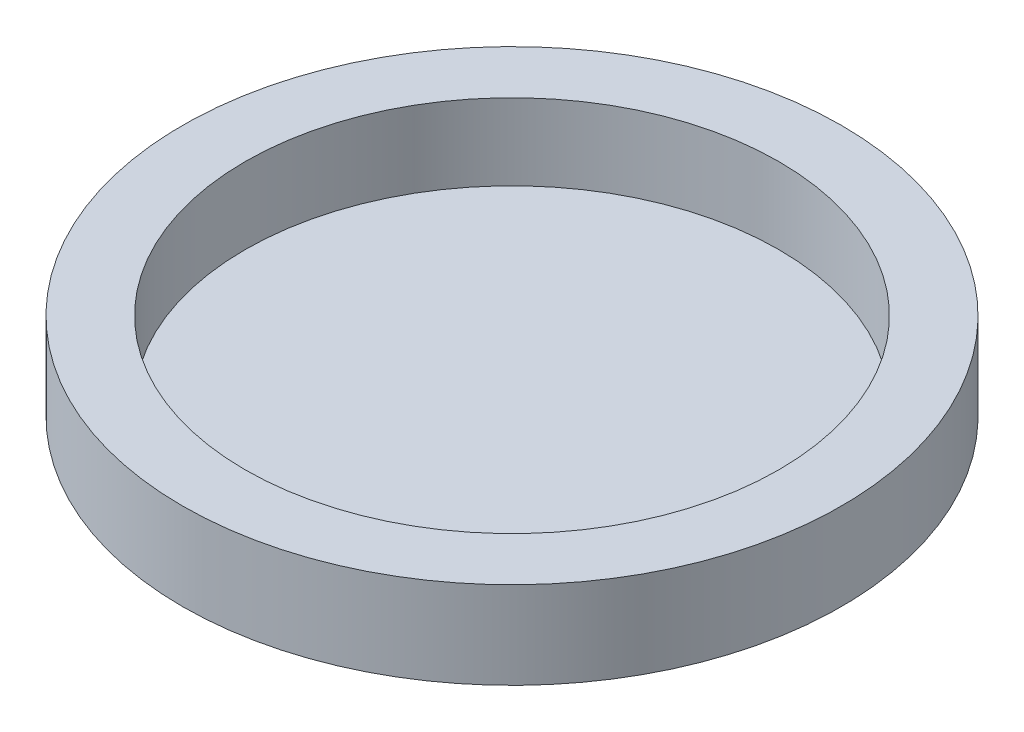
ISO-10303-21;
HEADER;
FILE_DESCRIPTION(('STEP AP214'),'2;1');
FILE_NAME('part.step','',(''),(''),'','','');
FILE_SCHEMA(('AUTOMOTIVE_DESIGN { 1 0 10303 214 1 1 1 1 }'));
ENDSEC;
DATA;
#1=APPLICATION_CONTEXT('core data for automotive mechanical design processes');
#2=APPLICATION_PROTOCOL_DEFINITION('international standard','automotive_design',2000,#1);
#3=PRODUCT_CONTEXT('',#1,'mechanical');
#4=PRODUCT('Part','Part','',(#3));
#5=PRODUCT_RELATED_PRODUCT_CATEGORY('part','',(#4));
#6=PRODUCT_DEFINITION_FORMATION('','',#4);
#7=PRODUCT_DEFINITION_CONTEXT('part definition',#1,'design');
#8=PRODUCT_DEFINITION('design','',#6,#7);
#9=PRODUCT_DEFINITION_SHAPE('','',#8);
#10=(LENGTH_UNIT() NAMED_UNIT(*) SI_UNIT(.MILLI.,.METRE.));
#11=(NAMED_UNIT(*) PLANE_ANGLE_UNIT() SI_UNIT($,.RADIAN.));
#12=(NAMED_UNIT(*) SI_UNIT($,.STERADIAN.) SOLID_ANGLE_UNIT());
#13=UNCERTAINTY_MEASURE_WITH_UNIT(LENGTH_MEASURE(1.E-05),#10,'distance_accuracy_value','');
#14=(GEOMETRIC_REPRESENTATION_CONTEXT(3) GLOBAL_UNCERTAINTY_ASSIGNED_CONTEXT((#13)) GLOBAL_UNIT_ASSIGNED_CONTEXT((#10,
#11,#12)) REPRESENTATION_CONTEXT('',''));
#15=CARTESIAN_POINT('',(0.,0.,0.));
#16=DIRECTION('',(0.,0.,1.));
#17=DIRECTION('',(1.,0.,0.));
#18=AXIS2_PLACEMENT_3D('',#15,#16,#17);
#19=CARTESIAN_POINT('',(0.,8.,0.));
#20=DIRECTION('',(0.,-1.,0.));
#21=DIRECTION('',(0.,0.,-1.));
#22=AXIS2_PLACEMENT_3D('',#19,#20,#21);
#23=CYLINDRICAL_SURFACE('',#22,30.25);
#24=CARTESIAN_POINT('',(0.,8.,0.));
#25=DIRECTION('',(0.,1.,0.));
#26=DIRECTION('',(0.,0.,1.));
#27=AXIS2_PLACEMENT_3D('',#24,#25,#26);
#28=CIRCLE('',#27,30.25);
#29=CARTESIAN_POINT('',(0.,8.,30.25));
#30=VERTEX_POINT('',#29);
#31=EDGE_CURVE('E10',#30,#30,#28,.T.);
#32=ORIENTED_EDGE('',*,*,#31,.F.);
#33=EDGE_LOOP('',(#32));
#34=FACE_BOUND('',#33,.T.);
#35=CARTESIAN_POINT('',(0.,0.,0.));
#36=DIRECTION('',(0.,1.,0.));
#37=DIRECTION('',(0.,0.,1.));
#38=AXIS2_PLACEMENT_3D('',#35,#36,#37);
#39=CIRCLE('',#38,30.25);
#40=CARTESIAN_POINT('',(0.,0.,30.25));
#41=VERTEX_POINT('',#40);
#42=EDGE_CURVE('E46',#41,#41,#39,.T.);
#43=ORIENTED_EDGE('',*,*,#42,.T.);
#44=EDGE_LOOP('',(#43));
#45=FACE_BOUND('',#44,.T.);
#46=ADVANCED_FACE('F43',(#34,#45),#23,.T.);
#47=CARTESIAN_POINT('',(0.,8.,0.));
#48=DIRECTION('',(0.,1.,0.));
#49=DIRECTION('',(0.,0.,1.));
#50=AXIS2_PLACEMENT_3D('',#47,#48,#49);
#51=PLANE('',#50);
#52=CARTESIAN_POINT('',(0.,8.,0.));
#53=DIRECTION('',(0.,1.,0.));
#54=DIRECTION('',(0.,0.,1.));
#55=AXIS2_PLACEMENT_3D('',#52,#53,#54);
#56=CIRCLE('',#55,24.5);
#57=CARTESIAN_POINT('',(0.,8.,24.5));
#58=VERTEX_POINT('',#57);
#59=EDGE_CURVE('E57',#58,#58,#56,.T.);
#60=ORIENTED_EDGE('',*,*,#59,.F.);
#61=EDGE_LOOP('',(#60));
#62=FACE_BOUND('',#61,.T.);
#63=ORIENTED_EDGE('',*,*,#31,.T.);
#64=EDGE_LOOP('',(#63));
#65=FACE_BOUND('',#64,.T.);
#66=ADVANCED_FACE('F74',(#62,#65),#51,.T.);
#67=CARTESIAN_POINT('',(0.,0.,0.));
#68=DIRECTION('',(0.,1.,0.));
#69=DIRECTION('',(0.,0.,1.));
#70=AXIS2_PLACEMENT_3D('',#67,#68,#69);
#71=PLANE('',#70);
#72=ORIENTED_EDGE('',*,*,#42,.F.);
#73=EDGE_LOOP('',(#72));
#74=FACE_BOUND('',#73,.T.);
#75=ADVANCED_FACE('F70',(#74),#71,.F.);
#76=CARTESIAN_POINT('',(0.,1.,0.));
#77=DIRECTION('',(0.,1.,0.));
#78=DIRECTION('',(0.,0.,1.));
#79=AXIS2_PLACEMENT_3D('',#76,#77,#78);
#80=CYLINDRICAL_SURFACE('',#79,24.5);
#81=CARTESIAN_POINT('',(0.,1.,0.));
#82=DIRECTION('',(0.,1.,0.));
#83=DIRECTION('',(0.,0.,1.));
#84=AXIS2_PLACEMENT_3D('',#81,#82,#83);
#85=CIRCLE('',#84,24.5);
#86=CARTESIAN_POINT('',(0.,1.,24.5));
#87=VERTEX_POINT('',#86);
#88=EDGE_CURVE('E55',#87,#87,#85,.T.);
#89=ORIENTED_EDGE('',*,*,#88,.F.);
#90=EDGE_LOOP('',(#89));
#91=FACE_BOUND('',#90,.T.);
#92=ORIENTED_EDGE('',*,*,#59,.T.);
#93=EDGE_LOOP('',(#92));
#94=FACE_BOUND('',#93,.T.);
#95=ADVANCED_FACE('F67',(#91,#94),#80,.F.);
#96=CARTESIAN_POINT('',(0.,1.,0.));
#97=DIRECTION('',(0.,1.,0.));
#98=DIRECTION('',(0.,0.,1.));
#99=AXIS2_PLACEMENT_3D('',#96,#97,#98);
#100=PLANE('',#99);
#101=ORIENTED_EDGE('',*,*,#88,.T.);
#102=EDGE_LOOP('',(#101));
#103=FACE_BOUND('',#102,.T.);
#104=ADVANCED_FACE('F65',(#103),#100,.T.);
#105=CLOSED_SHELL('',(#46,#66,#75,#95,#104));
#106=MANIFOLD_SOLID_BREP('B2',#105);
#107=ADVANCED_BREP_SHAPE_REPRESENTATION('',(#18,#106),#14);
#108=SHAPE_DEFINITION_REPRESENTATION(#9,#107);
ENDSEC;
END-ISO-10303-21;
